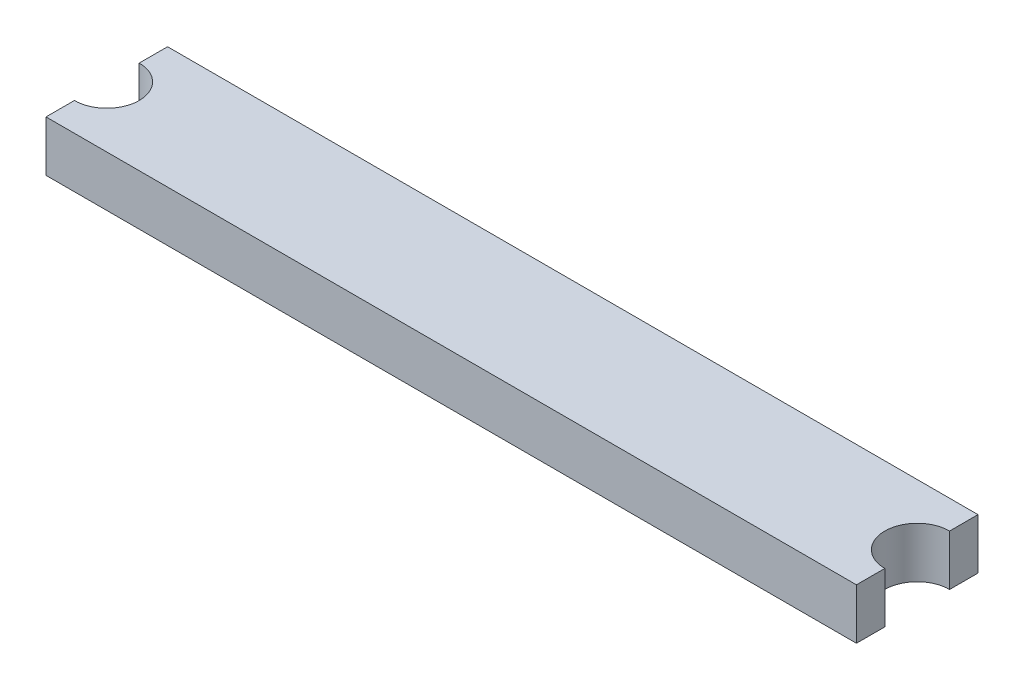
ISO-10303-21;
HEADER;
FILE_DESCRIPTION(('STEP AP214'),'2;1');
FILE_NAME('part.step','',(''),(''),'','','');
FILE_SCHEMA(('AUTOMOTIVE_DESIGN { 1 0 10303 214 1 1 1 1 }'));
ENDSEC;
DATA;
#1=APPLICATION_CONTEXT('core data for automotive mechanical design processes');
#2=APPLICATION_PROTOCOL_DEFINITION('international standard','automotive_design',2000,#1);
#3=PRODUCT_CONTEXT('',#1,'mechanical');
#4=PRODUCT('Part','Part','',(#3));
#5=PRODUCT_RELATED_PRODUCT_CATEGORY('part','',(#4));
#6=PRODUCT_DEFINITION_FORMATION('','',#4);
#7=PRODUCT_DEFINITION_CONTEXT('part definition',#1,'design');
#8=PRODUCT_DEFINITION('design','',#6,#7);
#9=PRODUCT_DEFINITION_SHAPE('','',#8);
#10=(LENGTH_UNIT() NAMED_UNIT(*) SI_UNIT(.MILLI.,.METRE.));
#11=(NAMED_UNIT(*) PLANE_ANGLE_UNIT() SI_UNIT($,.RADIAN.));
#12=(NAMED_UNIT(*) SI_UNIT($,.STERADIAN.) SOLID_ANGLE_UNIT());
#13=UNCERTAINTY_MEASURE_WITH_UNIT(LENGTH_MEASURE(1.E-05),#10,'distance_accuracy_value','');
#14=(GEOMETRIC_REPRESENTATION_CONTEXT(3) GLOBAL_UNCERTAINTY_ASSIGNED_CONTEXT((#13)) GLOBAL_UNIT_ASSIGNED_CONTEXT((#10,
#11,#12)) REPRESENTATION_CONTEXT('',''));
#15=CARTESIAN_POINT('',(0.,0.,0.));
#16=DIRECTION('',(0.,0.,1.));
#17=DIRECTION('',(1.,0.,0.));
#18=AXIS2_PLACEMENT_3D('',#15,#16,#17);
#19=CARTESIAN_POINT('',(200.,25.,-29.9999999999999));
#20=DIRECTION('',(-1.,0.,0.));
#21=DIRECTION('',(0.,0.,1.));
#22=AXIS2_PLACEMENT_3D('',#19,#20,#21);
#23=PLANE('',#22);
#24=DIRECTION('',(0.,0.,-1.));
#25=VECTOR('',#24,1.);
#26=CARTESIAN_POINT('',(200.,0.,-29.9999999999999));
#27=LINE('',#26,#25);
#28=CARTESIAN_POINT('',(200.,0.,30.));
#29=VERTEX_POINT('',#28);
#30=CARTESIAN_POINT('',(200.,0.,16.0000000000001));
#31=VERTEX_POINT('',#30);
#32=EDGE_CURVE('E122',#29,#31,#27,.T.);
#33=ORIENTED_EDGE('',*,*,#32,.T.);
#34=DIRECTION('',(0.,1.,0.));
#35=VECTOR('',#34,1.);
#36=CARTESIAN_POINT('',(200.,0.,16.0000000000001));
#37=LINE('',#36,#35);
#38=CARTESIAN_POINT('',(200.,25.,16.0000000000001));
#39=VERTEX_POINT('',#38);
#40=EDGE_CURVE('E61',#31,#39,#37,.T.);
#41=ORIENTED_EDGE('',*,*,#40,.T.);
#42=DIRECTION('',(0.,0.,-1.));
#43=VECTOR('',#42,1.);
#44=CARTESIAN_POINT('',(200.,25.,-29.9999999999999));
#45=LINE('',#44,#43);
#46=CARTESIAN_POINT('',(200.,25.,30.));
#47=VERTEX_POINT('',#46);
#48=EDGE_CURVE('E166',#47,#39,#45,.T.);
#49=ORIENTED_EDGE('',*,*,#48,.F.);
#50=DIRECTION('',(0.,-1.,0.));
#51=VECTOR('',#50,1.);
#52=CARTESIAN_POINT('',(200.,25.,30.));
#53=LINE('',#52,#51);
#54=EDGE_CURVE('E143',#47,#29,#53,.T.);
#55=ORIENTED_EDGE('',*,*,#54,.T.);
#56=EDGE_LOOP('',(#33,#41,#49,#55));
#57=FACE_BOUND('',#56,.T.);
#58=ADVANCED_FACE('F37',(#57),#23,.F.);
#59=CARTESIAN_POINT('',(-200.,25.,-30.));
#60=DIRECTION('',(1.,0.,0.));
#61=DIRECTION('',(0.,0.,-1.));
#62=AXIS2_PLACEMENT_3D('',#59,#60,#61);
#63=PLANE('',#62);
#64=DIRECTION('',(0.,0.,1.));
#65=VECTOR('',#64,1.);
#66=CARTESIAN_POINT('',(-200.,0.,-30.));
#67=LINE('',#66,#65);
#68=CARTESIAN_POINT('',(-200.,0.,-30.));
#69=VERTEX_POINT('',#68);
#70=CARTESIAN_POINT('',(-200.,0.,-16.));
#71=VERTEX_POINT('',#70);
#72=EDGE_CURVE('E136',#69,#71,#67,.T.);
#73=ORIENTED_EDGE('',*,*,#72,.T.);
#74=DIRECTION('',(0.,1.,0.));
#75=VECTOR('',#74,1.);
#76=CARTESIAN_POINT('',(-200.,0.,-16.));
#77=LINE('',#76,#75);
#78=CARTESIAN_POINT('',(-200.,25.,-16.));
#79=VERTEX_POINT('',#78);
#80=EDGE_CURVE('E53',#71,#79,#77,.T.);
#81=ORIENTED_EDGE('',*,*,#80,.T.);
#82=DIRECTION('',(0.,0.,1.));
#83=VECTOR('',#82,1.);
#84=CARTESIAN_POINT('',(-200.,25.,-30.));
#85=LINE('',#84,#83);
#86=CARTESIAN_POINT('',(-200.,25.,-30.));
#87=VERTEX_POINT('',#86);
#88=EDGE_CURVE('E171',#87,#79,#85,.T.);
#89=ORIENTED_EDGE('',*,*,#88,.F.);
#90=DIRECTION('',(0.,-1.,0.));
#91=VECTOR('',#90,1.);
#92=CARTESIAN_POINT('',(-200.,25.,-30.));
#93=LINE('',#92,#91);
#94=EDGE_CURVE('E151',#87,#69,#93,.T.);
#95=ORIENTED_EDGE('',*,*,#94,.T.);
#96=EDGE_LOOP('',(#73,#81,#89,#95));
#97=FACE_BOUND('',#96,.T.);
#98=ADVANCED_FACE('F205',(#97),#63,.F.);
#99=CARTESIAN_POINT('',(200.,25.,-16.));
#100=VERTEX_POINT('',#99);
#101=CARTESIAN_POINT('',(200.,25.,-29.9999999999999));
#102=VERTEX_POINT('',#101);
#103=EDGE_CURVE('E112',#100,#102,#45,.T.);
#104=ORIENTED_EDGE('',*,*,#103,.F.);
#105=DIRECTION('',(0.,1.,0.));
#106=VECTOR('',#105,1.);
#107=CARTESIAN_POINT('',(200.,0.,-16.));
#108=LINE('',#107,#106);
#109=CARTESIAN_POINT('',(200.,0.,-16.));
#110=VERTEX_POINT('',#109);
#111=EDGE_CURVE('E101',#100,#110,#108,.F.);
#112=ORIENTED_EDGE('',*,*,#111,.T.);
#113=CARTESIAN_POINT('',(200.,0.,-29.9999999999999));
#114=VERTEX_POINT('',#113);
#115=EDGE_CURVE('E110',#110,#114,#27,.T.);
#116=ORIENTED_EDGE('',*,*,#115,.T.);
#117=DIRECTION('',(0.,-1.,0.));
#118=VECTOR('',#117,1.);
#119=CARTESIAN_POINT('',(200.,25.,-29.9999999999999));
#120=LINE('',#119,#118);
#121=EDGE_CURVE('E46',#102,#114,#120,.T.);
#122=ORIENTED_EDGE('',*,*,#121,.F.);
#123=EDGE_LOOP('',(#104,#112,#116,#122));
#124=FACE_BOUND('',#123,.T.);
#125=ADVANCED_FACE('F39',(#124),#23,.F.);
#126=CARTESIAN_POINT('',(-200.,25.,-30.));
#127=DIRECTION('',(0.,0.,1.));
#128=DIRECTION('',(1.,0.,0.));
#129=AXIS2_PLACEMENT_3D('',#126,#127,#128);
#130=PLANE('',#129);
#131=DIRECTION('',(-1.,0.,0.));
#132=VECTOR('',#131,1.);
#133=CARTESIAN_POINT('',(-200.,0.,-30.));
#134=LINE('',#133,#132);
#135=EDGE_CURVE('E119',#114,#69,#134,.T.);
#136=ORIENTED_EDGE('',*,*,#135,.T.);
#137=ORIENTED_EDGE('',*,*,#94,.F.);
#138=DIRECTION('',(-1.,0.,0.));
#139=VECTOR('',#138,1.);
#140=CARTESIAN_POINT('',(-200.,25.,-30.));
#141=LINE('',#140,#139);
#142=EDGE_CURVE('E160',#102,#87,#141,.T.);
#143=ORIENTED_EDGE('',*,*,#142,.F.);
#144=ORIENTED_EDGE('',*,*,#121,.T.);
#145=EDGE_LOOP('',(#136,#137,#143,#144));
#146=FACE_BOUND('',#145,.T.);
#147=ADVANCED_FACE('F158',(#146),#130,.F.);
#148=CARTESIAN_POINT('',(-200.,25.,16.));
#149=VERTEX_POINT('',#148);
#150=CARTESIAN_POINT('',(-200.,25.,30.0000000000001));
#151=VERTEX_POINT('',#150);
#152=EDGE_CURVE('E165',#149,#151,#85,.T.);
#153=ORIENTED_EDGE('',*,*,#152,.F.);
#154=DIRECTION('',(0.,1.,0.));
#155=VECTOR('',#154,1.);
#156=CARTESIAN_POINT('',(-200.,0.,16.));
#157=LINE('',#156,#155);
#158=CARTESIAN_POINT('',(-200.,0.,16.));
#159=VERTEX_POINT('',#158);
#160=EDGE_CURVE('E127',#149,#159,#157,.F.);
#161=ORIENTED_EDGE('',*,*,#160,.T.);
#162=CARTESIAN_POINT('',(-200.,0.,30.0000000000001));
#163=VERTEX_POINT('',#162);
#164=EDGE_CURVE('E135',#159,#163,#67,.T.);
#165=ORIENTED_EDGE('',*,*,#164,.T.);
#166=DIRECTION('',(0.,-1.,0.));
#167=VECTOR('',#166,1.);
#168=CARTESIAN_POINT('',(-200.,25.,30.0000000000001));
#169=LINE('',#168,#167);
#170=EDGE_CURVE('E147',#151,#163,#169,.T.);
#171=ORIENTED_EDGE('',*,*,#170,.F.);
#172=EDGE_LOOP('',(#153,#161,#165,#171));
#173=FACE_BOUND('',#172,.T.);
#174=ADVANCED_FACE('F208',(#173),#63,.F.);
#175=CARTESIAN_POINT('',(-200.,25.,30.0000000000001));
#176=DIRECTION('',(0.,0.,-1.));
#177=DIRECTION('',(-1.,0.,0.));
#178=AXIS2_PLACEMENT_3D('',#175,#176,#177);
#179=PLANE('',#178);
#180=DIRECTION('',(1.,0.,0.));
#181=VECTOR('',#180,1.);
#182=CARTESIAN_POINT('',(-200.,0.,30.0000000000001));
#183=LINE('',#182,#181);
#184=EDGE_CURVE('E140',#163,#29,#183,.T.);
#185=ORIENTED_EDGE('',*,*,#184,.T.);
#186=ORIENTED_EDGE('',*,*,#54,.F.);
#187=DIRECTION('',(1.,0.,0.));
#188=VECTOR('',#187,1.);
#189=CARTESIAN_POINT('',(-200.,25.,30.0000000000001));
#190=LINE('',#189,#188);
#191=EDGE_CURVE('E131',#151,#47,#190,.T.);
#192=ORIENTED_EDGE('',*,*,#191,.F.);
#193=ORIENTED_EDGE('',*,*,#170,.T.);
#194=EDGE_LOOP('',(#185,#186,#192,#193));
#195=FACE_BOUND('',#194,.T.);
#196=ADVANCED_FACE('F186',(#195),#179,.F.);
#197=CARTESIAN_POINT('',(0.,25.,0.));
#198=DIRECTION('',(0.,1.,0.));
#199=DIRECTION('',(0.,0.,1.));
#200=AXIS2_PLACEMENT_3D('',#197,#198,#199);
#201=PLANE('',#200);
#202=CARTESIAN_POINT('',(-200.,25.,0.));
#203=DIRECTION('',(0.,1.,0.));
#204=DIRECTION('',(0.,0.,1.));
#205=AXIS2_PLACEMENT_3D('',#202,#203,#204);
#206=CIRCLE('',#205,16.);
#207=EDGE_CURVE('E199',#149,#79,#206,.T.);
#208=ORIENTED_EDGE('',*,*,#207,.F.);
#209=ORIENTED_EDGE('',*,*,#152,.T.);
#210=ORIENTED_EDGE('',*,*,#191,.T.);
#211=ORIENTED_EDGE('',*,*,#48,.T.);
#212=CARTESIAN_POINT('',(200.,25.,0.));
#213=DIRECTION('',(0.,1.,0.));
#214=DIRECTION('',(0.,0.,1.));
#215=AXIS2_PLACEMENT_3D('',#212,#213,#214);
#216=CIRCLE('',#215,16.);
#217=EDGE_CURVE('E196',#100,#39,#216,.T.);
#218=ORIENTED_EDGE('',*,*,#217,.F.);
#219=ORIENTED_EDGE('',*,*,#103,.T.);
#220=ORIENTED_EDGE('',*,*,#142,.T.);
#221=ORIENTED_EDGE('',*,*,#88,.T.);
#222=EDGE_LOOP('',(#208,#209,#210,#211,#218,#219,#220,#221));
#223=FACE_BOUND('',#222,.T.);
#224=ADVANCED_FACE('F181',(#223),#201,.T.);
#225=CARTESIAN_POINT('',(0.,0.,0.));
#226=DIRECTION('',(0.,1.,0.));
#227=DIRECTION('',(0.,0.,1.));
#228=AXIS2_PLACEMENT_3D('',#225,#226,#227);
#229=PLANE('',#228);
#230=ORIENTED_EDGE('',*,*,#164,.F.);
#231=CARTESIAN_POINT('',(-200.,0.,0.));
#232=DIRECTION('',(0.,1.,0.));
#233=DIRECTION('',(0.,0.,1.));
#234=AXIS2_PLACEMENT_3D('',#231,#232,#233);
#235=CIRCLE('',#234,16.);
#236=EDGE_CURVE('E114',#159,#71,#235,.T.);
#237=ORIENTED_EDGE('',*,*,#236,.T.);
#238=ORIENTED_EDGE('',*,*,#72,.F.);
#239=ORIENTED_EDGE('',*,*,#135,.F.);
#240=ORIENTED_EDGE('',*,*,#115,.F.);
#241=CARTESIAN_POINT('',(200.,0.,0.));
#242=DIRECTION('',(0.,1.,0.));
#243=DIRECTION('',(0.,0.,1.));
#244=AXIS2_PLACEMENT_3D('',#241,#242,#243);
#245=CIRCLE('',#244,16.);
#246=EDGE_CURVE('E11',#110,#31,#245,.T.);
#247=ORIENTED_EDGE('',*,*,#246,.T.);
#248=ORIENTED_EDGE('',*,*,#32,.F.);
#249=ORIENTED_EDGE('',*,*,#184,.F.);
#250=EDGE_LOOP('',(#230,#237,#238,#239,#240,#247,#248,#249));
#251=FACE_BOUND('',#250,.T.);
#252=ADVANCED_FACE('F117',(#251),#229,.F.);
#253=CARTESIAN_POINT('',(200.,0.,0.));
#254=DIRECTION('',(0.,1.,0.));
#255=DIRECTION('',(0.,0.,1.));
#256=AXIS2_PLACEMENT_3D('',#253,#254,#255);
#257=CYLINDRICAL_SURFACE('',#256,16.);
#258=ORIENTED_EDGE('',*,*,#246,.F.);
#259=ORIENTED_EDGE('',*,*,#111,.F.);
#260=ORIENTED_EDGE('',*,*,#217,.T.);
#261=ORIENTED_EDGE('',*,*,#40,.F.);
#262=EDGE_LOOP('',(#258,#259,#260,#261));
#263=FACE_BOUND('',#262,.T.);
#264=ADVANCED_FACE('F100',(#263),#257,.F.);
#265=CARTESIAN_POINT('',(-200.,0.,0.));
#266=DIRECTION('',(0.,1.,0.));
#267=DIRECTION('',(0.,0.,1.));
#268=AXIS2_PLACEMENT_3D('',#265,#266,#267);
#269=CYLINDRICAL_SURFACE('',#268,16.);
#270=ORIENTED_EDGE('',*,*,#236,.F.);
#271=ORIENTED_EDGE('',*,*,#160,.F.);
#272=ORIENTED_EDGE('',*,*,#207,.T.);
#273=ORIENTED_EDGE('',*,*,#80,.F.);
#274=EDGE_LOOP('',(#270,#271,#272,#273));
#275=FACE_BOUND('',#274,.T.);
#276=ADVANCED_FACE('F229',(#275),#269,.F.);
#277=CLOSED_SHELL('',(#58,#98,#125,#147,#174,#196,#224,#252,#264,#276));
#278=MANIFOLD_SOLID_BREP('B2',#277);
#279=ADVANCED_BREP_SHAPE_REPRESENTATION('',(#18,#278),#14);
#280=SHAPE_DEFINITION_REPRESENTATION(#9,#279);
ENDSEC;
END-ISO-10303-21;
